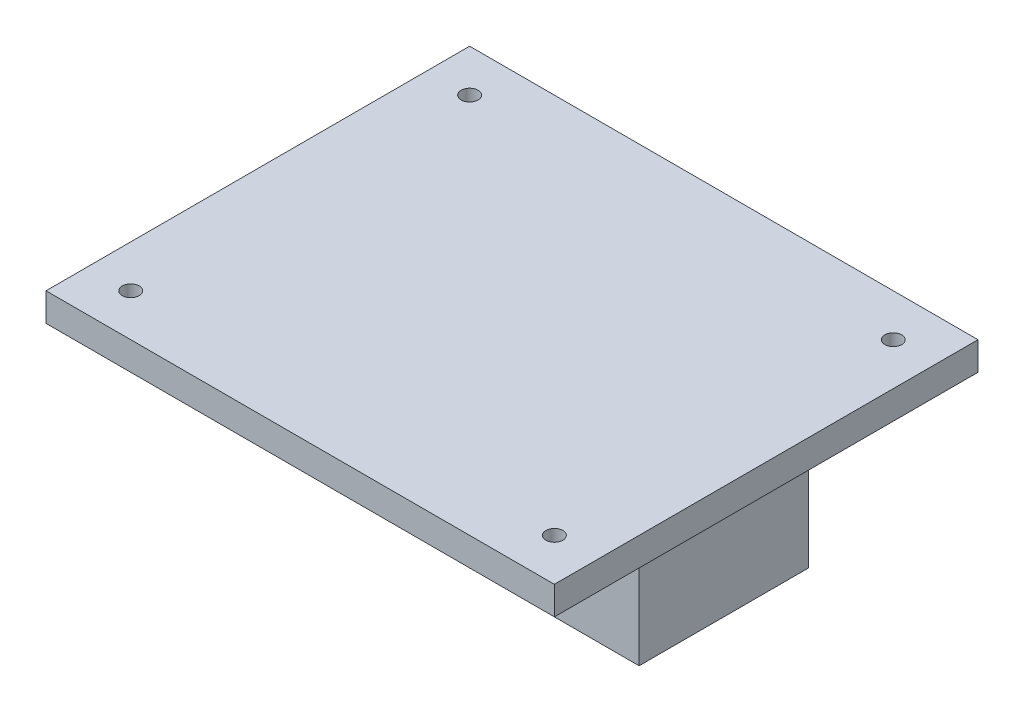
ISO-10303-21;
HEADER;
FILE_DESCRIPTION(('STEP AP214'),'2;1');
FILE_NAME('part.step','',(''),(''),'','','');
FILE_SCHEMA(('AUTOMOTIVE_DESIGN { 1 0 10303 214 1 1 1 1 }'));
ENDSEC;
DATA;
#1=APPLICATION_CONTEXT('core data for automotive mechanical design processes');
#2=APPLICATION_PROTOCOL_DEFINITION('international standard','automotive_design',2000,#1);
#3=PRODUCT_CONTEXT('',#1,'mechanical');
#4=PRODUCT('Part','Part','',(#3));
#5=PRODUCT_RELATED_PRODUCT_CATEGORY('part','',(#4));
#6=PRODUCT_DEFINITION_FORMATION('','',#4);
#7=PRODUCT_DEFINITION_CONTEXT('part definition',#1,'design');
#8=PRODUCT_DEFINITION('design','',#6,#7);
#9=PRODUCT_DEFINITION_SHAPE('','',#8);
#10=(LENGTH_UNIT() NAMED_UNIT(*) SI_UNIT(.MILLI.,.METRE.));
#11=(NAMED_UNIT(*) PLANE_ANGLE_UNIT() SI_UNIT($,.RADIAN.));
#12=(NAMED_UNIT(*) SI_UNIT($,.STERADIAN.) SOLID_ANGLE_UNIT());
#13=UNCERTAINTY_MEASURE_WITH_UNIT(LENGTH_MEASURE(1.E-05),#10,'distance_accuracy_value','');
#14=(GEOMETRIC_REPRESENTATION_CONTEXT(3) GLOBAL_UNCERTAINTY_ASSIGNED_CONTEXT((#13)) GLOBAL_UNIT_ASSIGNED_CONTEXT((#10,
#11,#12)) REPRESENTATION_CONTEXT('',''));
#15=CARTESIAN_POINT('',(0.,0.,0.));
#16=DIRECTION('',(0.,0.,1.));
#17=DIRECTION('',(1.,0.,0.));
#18=AXIS2_PLACEMENT_3D('',#15,#16,#17);
#19=CARTESIAN_POINT('',(0.,0.,0.));
#20=DIRECTION('',(0.,1.,0.));
#21=DIRECTION('',(0.,0.,1.));
#22=AXIS2_PLACEMENT_3D('',#19,#20,#21);
#23=PLANE('',#22);
#24=DIRECTION('',(0.,0.,1.));
#25=VECTOR('',#24,1.);
#26=CARTESIAN_POINT('',(-45.,0.,30.));
#27=LINE('',#26,#25);
#28=CARTESIAN_POINT('',(-45.,0.,-30.));
#29=VERTEX_POINT('',#28);
#30=CARTESIAN_POINT('',(-45.,0.,30.));
#31=VERTEX_POINT('',#30);
#32=EDGE_CURVE('E262',#29,#31,#27,.T.);
#33=ORIENTED_EDGE('',*,*,#32,.F.);
#34=DIRECTION('',(1.,0.,0.));
#35=VECTOR('',#34,1.);
#36=CARTESIAN_POINT('',(-75.,0.,-30.));
#37=LINE('',#36,#35);
#38=CARTESIAN_POINT('',(-75.,0.,-30.));
#39=VERTEX_POINT('',#38);
#40=EDGE_CURVE('E267',#39,#29,#37,.T.);
#41=ORIENTED_EDGE('',*,*,#40,.F.);
#42=DIRECTION('',(0.,0.,-1.));
#43=VECTOR('',#42,1.);
#44=CARTESIAN_POINT('',(-75.,0.,30.));
#45=LINE('',#44,#43);
#46=CARTESIAN_POINT('',(-75.,0.,30.));
#47=VERTEX_POINT('',#46);
#48=EDGE_CURVE('E281',#47,#39,#45,.T.);
#49=ORIENTED_EDGE('',*,*,#48,.F.);
#50=DIRECTION('',(-1.,0.,0.));
#51=VECTOR('',#50,1.);
#52=CARTESIAN_POINT('',(-75.,0.,30.));
#53=LINE('',#52,#51);
#54=EDGE_CURVE('E278',#31,#47,#53,.T.);
#55=ORIENTED_EDGE('',*,*,#54,.F.);
#56=EDGE_LOOP('',(#33,#41,#49,#55));
#57=FACE_BOUND('',#56,.T.);
#58=CARTESIAN_POINT('',(75.,0.,-60.));
#59=DIRECTION('',(0.,1.,0.));
#60=DIRECTION('',(0.,0.,1.));
#61=AXIS2_PLACEMENT_3D('',#58,#59,#60);
#62=CIRCLE('',#61,3.00000000000001);
#63=CARTESIAN_POINT('',(75.,0.,-57.));
#64=VERTEX_POINT('',#63);
#65=EDGE_CURVE('E39',#64,#64,#62,.T.);
#66=ORIENTED_EDGE('',*,*,#65,.T.);
#67=EDGE_LOOP('',(#66));
#68=FACE_BOUND('',#67,.T.);
#69=CARTESIAN_POINT('',(75.,0.,60.));
#70=DIRECTION('',(0.,1.,0.));
#71=DIRECTION('',(0.,0.,1.));
#72=AXIS2_PLACEMENT_3D('',#69,#70,#71);
#73=CIRCLE('',#72,3.00000000000001);
#74=CARTESIAN_POINT('',(75.,0.,63.));
#75=VERTEX_POINT('',#74);
#76=EDGE_CURVE('E340',#75,#75,#73,.T.);
#77=ORIENTED_EDGE('',*,*,#76,.T.);
#78=EDGE_LOOP('',(#77));
#79=FACE_BOUND('',#78,.T.);
#80=CARTESIAN_POINT('',(-75.,0.,60.));
#81=DIRECTION('',(0.,1.,0.));
#82=DIRECTION('',(0.,0.,1.));
#83=AXIS2_PLACEMENT_3D('',#80,#81,#82);
#84=CIRCLE('',#83,3.00000000000001);
#85=CARTESIAN_POINT('',(-75.,0.,63.));
#86=VERTEX_POINT('',#85);
#87=EDGE_CURVE('E338',#86,#86,#84,.T.);
#88=ORIENTED_EDGE('',*,*,#87,.T.);
#89=EDGE_LOOP('',(#88));
#90=FACE_BOUND('',#89,.T.);
#91=CARTESIAN_POINT('',(-75.,0.,-60.));
#92=DIRECTION('',(0.,1.,0.));
#93=DIRECTION('',(0.,0.,1.));
#94=AXIS2_PLACEMENT_3D('',#91,#92,#93);
#95=CIRCLE('',#94,3.00000000000001);
#96=CARTESIAN_POINT('',(-75.,0.,-57.));
#97=VERTEX_POINT('',#96);
#98=EDGE_CURVE('E309',#97,#97,#95,.T.);
#99=ORIENTED_EDGE('',*,*,#98,.T.);
#100=EDGE_LOOP('',(#99));
#101=FACE_BOUND('',#100,.T.);
#102=DIRECTION('',(0.,0.,-1.));
#103=VECTOR('',#102,1.);
#104=CARTESIAN_POINT('',(90.,0.,-75.));
#105=LINE('',#104,#103);
#106=CARTESIAN_POINT('',(90.,0.,75.));
#107=VERTEX_POINT('',#106);
#108=CARTESIAN_POINT('',(90.,0.,-75.));
#109=VERTEX_POINT('',#108);
#110=EDGE_CURVE('E321',#107,#109,#105,.T.);
#111=ORIENTED_EDGE('',*,*,#110,.F.);
#112=DIRECTION('',(1.,0.,0.));
#113=VECTOR('',#112,1.);
#114=CARTESIAN_POINT('',(-90.,0.,75.));
#115=LINE('',#114,#113);
#116=CARTESIAN_POINT('',(-90.,0.,75.));
#117=VERTEX_POINT('',#116);
#118=EDGE_CURVE('E314',#117,#107,#115,.T.);
#119=ORIENTED_EDGE('',*,*,#118,.F.);
#120=DIRECTION('',(0.,0.,1.));
#121=VECTOR('',#120,1.);
#122=CARTESIAN_POINT('',(-90.,0.,-75.));
#123=LINE('',#122,#121);
#124=CARTESIAN_POINT('',(-90.,0.,-75.));
#125=VERTEX_POINT('',#124);
#126=EDGE_CURVE('E326',#125,#117,#123,.T.);
#127=ORIENTED_EDGE('',*,*,#126,.F.);
#128=DIRECTION('',(-1.,0.,0.));
#129=VECTOR('',#128,1.);
#130=CARTESIAN_POINT('',(-90.,0.,-75.));
#131=LINE('',#130,#129);
#132=EDGE_CURVE('E324',#109,#125,#131,.T.);
#133=ORIENTED_EDGE('',*,*,#132,.F.);
#134=EDGE_LOOP('',(#111,#119,#127,#133));
#135=FACE_BOUND('',#134,.T.);
#136=DIRECTION('',(0.,0.,1.));
#137=VECTOR('',#136,1.);
#138=CARTESIAN_POINT('',(75.,0.,30.));
#139=LINE('',#138,#137);
#140=CARTESIAN_POINT('',(75.,0.,-30.));
#141=VERTEX_POINT('',#140);
#142=CARTESIAN_POINT('',(75.,0.,30.));
#143=VERTEX_POINT('',#142);
#144=EDGE_CURVE('E223',#141,#143,#139,.T.);
#145=ORIENTED_EDGE('',*,*,#144,.F.);
#146=DIRECTION('',(1.,0.,0.));
#147=VECTOR('',#146,1.);
#148=CARTESIAN_POINT('',(75.,0.,-30.));
#149=LINE('',#148,#147);
#150=CARTESIAN_POINT('',(45.,0.,-30.));
#151=VERTEX_POINT('',#150);
#152=EDGE_CURVE('E234',#151,#141,#149,.T.);
#153=ORIENTED_EDGE('',*,*,#152,.F.);
#154=DIRECTION('',(0.,0.,-1.));
#155=VECTOR('',#154,1.);
#156=CARTESIAN_POINT('',(45.,0.,30.));
#157=LINE('',#156,#155);
#158=CARTESIAN_POINT('',(45.,0.,30.));
#159=VERTEX_POINT('',#158);
#160=EDGE_CURVE('E246',#159,#151,#157,.T.);
#161=ORIENTED_EDGE('',*,*,#160,.F.);
#162=DIRECTION('',(-1.,0.,0.));
#163=VECTOR('',#162,1.);
#164=CARTESIAN_POINT('',(75.,0.,30.));
#165=LINE('',#164,#163);
#166=EDGE_CURVE('E243',#143,#159,#165,.T.);
#167=ORIENTED_EDGE('',*,*,#166,.F.);
#168=EDGE_LOOP('',(#145,#153,#161,#167));
#169=FACE_BOUND('',#168,.T.);
#170=ADVANCED_FACE('F35',(#57,#68,#79,#90,#101,#135,#169),#23,.F.);
#171=CARTESIAN_POINT('',(90.,10.,-75.));
#172=DIRECTION('',(-1.,0.,0.));
#173=DIRECTION('',(0.,0.,1.));
#174=AXIS2_PLACEMENT_3D('',#171,#172,#173);
#175=PLANE('',#174);
#176=ORIENTED_EDGE('',*,*,#110,.T.);
#177=DIRECTION('',(0.,-1.,0.));
#178=VECTOR('',#177,1.);
#179=CARTESIAN_POINT('',(90.,10.,-75.));
#180=LINE('',#179,#178);
#181=CARTESIAN_POINT('',(90.,10.,-75.));
#182=VERTEX_POINT('',#181);
#183=EDGE_CURVE('E11',#182,#109,#180,.T.);
#184=ORIENTED_EDGE('',*,*,#183,.F.);
#185=DIRECTION('',(0.,0.,-1.));
#186=VECTOR('',#185,1.);
#187=CARTESIAN_POINT('',(90.,10.,-75.));
#188=LINE('',#187,#186);
#189=CARTESIAN_POINT('',(90.,10.,75.));
#190=VERTEX_POINT('',#189);
#191=EDGE_CURVE('E310',#190,#182,#188,.T.);
#192=ORIENTED_EDGE('',*,*,#191,.F.);
#193=DIRECTION('',(0.,-1.,0.));
#194=VECTOR('',#193,1.);
#195=CARTESIAN_POINT('',(90.,10.,75.));
#196=LINE('',#195,#194);
#197=EDGE_CURVE('E320',#190,#107,#196,.T.);
#198=ORIENTED_EDGE('',*,*,#197,.T.);
#199=EDGE_LOOP('',(#176,#184,#192,#198));
#200=FACE_BOUND('',#199,.T.);
#201=ADVANCED_FACE('F37',(#200),#175,.F.);
#202=CARTESIAN_POINT('',(-90.,10.,-75.));
#203=DIRECTION('',(0.,0.,1.));
#204=DIRECTION('',(1.,0.,0.));
#205=AXIS2_PLACEMENT_3D('',#202,#203,#204);
#206=PLANE('',#205);
#207=ORIENTED_EDGE('',*,*,#132,.T.);
#208=DIRECTION('',(0.,-1.,0.));
#209=VECTOR('',#208,1.);
#210=CARTESIAN_POINT('',(-90.,10.,-75.));
#211=LINE('',#210,#209);
#212=CARTESIAN_POINT('',(-90.,10.,-75.));
#213=VERTEX_POINT('',#212);
#214=EDGE_CURVE('E44',#213,#125,#211,.T.);
#215=ORIENTED_EDGE('',*,*,#214,.F.);
#216=DIRECTION('',(-1.,0.,0.));
#217=VECTOR('',#216,1.);
#218=CARTESIAN_POINT('',(-90.,10.,-75.));
#219=LINE('',#218,#217);
#220=EDGE_CURVE('E313',#182,#213,#219,.T.);
#221=ORIENTED_EDGE('',*,*,#220,.F.);
#222=ORIENTED_EDGE('',*,*,#183,.T.);
#223=EDGE_LOOP('',(#207,#215,#221,#222));
#224=FACE_BOUND('',#223,.T.);
#225=ADVANCED_FACE('F371',(#224),#206,.F.);
#226=CARTESIAN_POINT('',(-90.,10.,-75.));
#227=DIRECTION('',(1.,0.,0.));
#228=DIRECTION('',(0.,0.,-1.));
#229=AXIS2_PLACEMENT_3D('',#226,#227,#228);
#230=PLANE('',#229);
#231=ORIENTED_EDGE('',*,*,#126,.T.);
#232=DIRECTION('',(0.,-1.,0.));
#233=VECTOR('',#232,1.);
#234=CARTESIAN_POINT('',(-90.,10.,75.));
#235=LINE('',#234,#233);
#236=CARTESIAN_POINT('',(-90.,10.,75.));
#237=VERTEX_POINT('',#236);
#238=EDGE_CURVE('E331',#237,#117,#235,.T.);
#239=ORIENTED_EDGE('',*,*,#238,.F.);
#240=DIRECTION('',(0.,0.,1.));
#241=VECTOR('',#240,1.);
#242=CARTESIAN_POINT('',(-90.,10.,-75.));
#243=LINE('',#242,#241);
#244=EDGE_CURVE('E316',#213,#237,#243,.T.);
#245=ORIENTED_EDGE('',*,*,#244,.F.);
#246=ORIENTED_EDGE('',*,*,#214,.T.);
#247=EDGE_LOOP('',(#231,#239,#245,#246));
#248=FACE_BOUND('',#247,.T.);
#249=ADVANCED_FACE('F379',(#248),#230,.F.);
#250=CARTESIAN_POINT('',(-90.,10.,75.));
#251=DIRECTION('',(0.,0.,-1.));
#252=DIRECTION('',(-1.,0.,0.));
#253=AXIS2_PLACEMENT_3D('',#250,#251,#252);
#254=PLANE('',#253);
#255=ORIENTED_EDGE('',*,*,#118,.T.);
#256=ORIENTED_EDGE('',*,*,#197,.F.);
#257=DIRECTION('',(1.,0.,0.));
#258=VECTOR('',#257,1.);
#259=CARTESIAN_POINT('',(-90.,10.,75.));
#260=LINE('',#259,#258);
#261=EDGE_CURVE('E318',#237,#190,#260,.T.);
#262=ORIENTED_EDGE('',*,*,#261,.F.);
#263=ORIENTED_EDGE('',*,*,#238,.T.);
#264=EDGE_LOOP('',(#255,#256,#262,#263));
#265=FACE_BOUND('',#264,.T.);
#266=ADVANCED_FACE('F376',(#265),#254,.F.);
#267=CARTESIAN_POINT('',(0.,10.,0.));
#268=DIRECTION('',(0.,1.,0.));
#269=DIRECTION('',(0.,0.,1.));
#270=AXIS2_PLACEMENT_3D('',#267,#268,#269);
#271=PLANE('',#270);
#272=CARTESIAN_POINT('',(75.,10.,-60.));
#273=DIRECTION('',(0.,1.,0.));
#274=DIRECTION('',(0.,0.,1.));
#275=AXIS2_PLACEMENT_3D('',#272,#273,#274);
#276=CIRCLE('',#275,3.00000000000001);
#277=CARTESIAN_POINT('',(75.,10.,-57.));
#278=VERTEX_POINT('',#277);
#279=EDGE_CURVE('E297',#278,#278,#276,.T.);
#280=ORIENTED_EDGE('',*,*,#279,.F.);
#281=EDGE_LOOP('',(#280));
#282=FACE_BOUND('',#281,.T.);
#283=CARTESIAN_POINT('',(75.,10.,60.));
#284=DIRECTION('',(0.,1.,0.));
#285=DIRECTION('',(0.,0.,1.));
#286=AXIS2_PLACEMENT_3D('',#283,#284,#285);
#287=CIRCLE('',#286,3.00000000000001);
#288=CARTESIAN_POINT('',(75.,10.,63.));
#289=VERTEX_POINT('',#288);
#290=EDGE_CURVE('E302',#289,#289,#287,.T.);
#291=ORIENTED_EDGE('',*,*,#290,.F.);
#292=EDGE_LOOP('',(#291));
#293=FACE_BOUND('',#292,.T.);
#294=CARTESIAN_POINT('',(-75.,10.,60.));
#295=DIRECTION('',(0.,1.,0.));
#296=DIRECTION('',(0.,0.,1.));
#297=AXIS2_PLACEMENT_3D('',#294,#295,#296);
#298=CIRCLE('',#297,3.00000000000001);
#299=CARTESIAN_POINT('',(-75.,10.,63.));
#300=VERTEX_POINT('',#299);
#301=EDGE_CURVE('E298',#300,#300,#298,.T.);
#302=ORIENTED_EDGE('',*,*,#301,.F.);
#303=EDGE_LOOP('',(#302));
#304=FACE_BOUND('',#303,.T.);
#305=CARTESIAN_POINT('',(-75.,10.,-60.));
#306=DIRECTION('',(0.,1.,0.));
#307=DIRECTION('',(0.,0.,1.));
#308=AXIS2_PLACEMENT_3D('',#305,#306,#307);
#309=CIRCLE('',#308,3.00000000000001);
#310=CARTESIAN_POINT('',(-75.,10.,-57.));
#311=VERTEX_POINT('',#310);
#312=EDGE_CURVE('E301',#311,#311,#309,.T.);
#313=ORIENTED_EDGE('',*,*,#312,.F.);
#314=EDGE_LOOP('',(#313));
#315=FACE_BOUND('',#314,.T.);
#316=ORIENTED_EDGE('',*,*,#191,.T.);
#317=ORIENTED_EDGE('',*,*,#220,.T.);
#318=ORIENTED_EDGE('',*,*,#244,.T.);
#319=ORIENTED_EDGE('',*,*,#261,.T.);
#320=EDGE_LOOP('',(#316,#317,#318,#319));
#321=FACE_BOUND('',#320,.T.);
#322=ADVANCED_FACE('F375',(#282,#293,#304,#315,#321),#271,.T.);
#323=CARTESIAN_POINT('',(-75.,-25.,-60.));
#324=DIRECTION('',(0.,1.,0.));
#325=DIRECTION('',(0.,0.,1.));
#326=AXIS2_PLACEMENT_3D('',#323,#324,#325);
#327=CYLINDRICAL_SURFACE('',#326,3.00000000000001);
#328=ORIENTED_EDGE('',*,*,#312,.T.);
#329=EDGE_LOOP('',(#328));
#330=FACE_BOUND('',#329,.T.);
#331=ORIENTED_EDGE('',*,*,#98,.F.);
#332=EDGE_LOOP('',(#331));
#333=FACE_BOUND('',#332,.T.);
#334=ADVANCED_FACE('F401',(#330,#333),#327,.F.);
#335=CARTESIAN_POINT('',(-75.,-25.,60.));
#336=DIRECTION('',(0.,1.,0.));
#337=DIRECTION('',(0.,0.,1.));
#338=AXIS2_PLACEMENT_3D('',#335,#336,#337);
#339=CYLINDRICAL_SURFACE('',#338,3.00000000000001);
#340=ORIENTED_EDGE('',*,*,#301,.T.);
#341=EDGE_LOOP('',(#340));
#342=FACE_BOUND('',#341,.T.);
#343=ORIENTED_EDGE('',*,*,#87,.F.);
#344=EDGE_LOOP('',(#343));
#345=FACE_BOUND('',#344,.T.);
#346=ADVANCED_FACE('F361',(#342,#345),#339,.F.);
#347=CARTESIAN_POINT('',(75.,-25.,60.));
#348=DIRECTION('',(0.,1.,0.));
#349=DIRECTION('',(0.,0.,1.));
#350=AXIS2_PLACEMENT_3D('',#347,#348,#349);
#351=CYLINDRICAL_SURFACE('',#350,3.00000000000001);
#352=ORIENTED_EDGE('',*,*,#290,.T.);
#353=EDGE_LOOP('',(#352));
#354=FACE_BOUND('',#353,.T.);
#355=ORIENTED_EDGE('',*,*,#76,.F.);
#356=EDGE_LOOP('',(#355));
#357=FACE_BOUND('',#356,.T.);
#358=ADVANCED_FACE('F351',(#354,#357),#351,.F.);
#359=CARTESIAN_POINT('',(75.,-25.,-60.));
#360=DIRECTION('',(0.,1.,0.));
#361=DIRECTION('',(0.,0.,1.));
#362=AXIS2_PLACEMENT_3D('',#359,#360,#361);
#363=CYLINDRICAL_SURFACE('',#362,3.00000000000001);
#364=ORIENTED_EDGE('',*,*,#279,.T.);
#365=EDGE_LOOP('',(#364));
#366=FACE_BOUND('',#365,.T.);
#367=ORIENTED_EDGE('',*,*,#65,.F.);
#368=EDGE_LOOP('',(#367));
#369=FACE_BOUND('',#368,.T.);
#370=ADVANCED_FACE('F348',(#366,#369),#363,.F.);
#371=CARTESIAN_POINT('',(-45.,-45.,30.));
#372=DIRECTION('',(-1.,0.,0.));
#373=DIRECTION('',(0.,0.,1.));
#374=AXIS2_PLACEMENT_3D('',#371,#372,#373);
#375=PLANE('',#374);
#376=ORIENTED_EDGE('',*,*,#32,.T.);
#377=DIRECTION('',(0.,1.,0.));
#378=VECTOR('',#377,1.);
#379=CARTESIAN_POINT('',(-45.,-45.,30.));
#380=LINE('',#379,#378);
#381=CARTESIAN_POINT('',(-45.,-45.,30.));
#382=VERTEX_POINT('',#381);
#383=EDGE_CURVE('E294',#382,#31,#380,.T.);
#384=ORIENTED_EDGE('',*,*,#383,.F.);
#385=DIRECTION('',(0.,0.,1.));
#386=VECTOR('',#385,1.);
#387=CARTESIAN_POINT('',(-45.,-45.,30.));
#388=LINE('',#387,#386);
#389=CARTESIAN_POINT('',(-45.,-45.,-30.));
#390=VERTEX_POINT('',#389);
#391=EDGE_CURVE('E263',#390,#382,#388,.T.);
#392=ORIENTED_EDGE('',*,*,#391,.F.);
#393=DIRECTION('',(0.,1.,0.));
#394=VECTOR('',#393,1.);
#395=CARTESIAN_POINT('',(-45.,-45.,-30.));
#396=LINE('',#395,#394);
#397=EDGE_CURVE('E275',#390,#29,#396,.T.);
#398=ORIENTED_EDGE('',*,*,#397,.T.);
#399=EDGE_LOOP('',(#376,#384,#392,#398));
#400=FACE_BOUND('',#399,.T.);
#401=ADVANCED_FACE('F350',(#400),#375,.F.);
#402=CARTESIAN_POINT('',(-75.,-45.,30.));
#403=DIRECTION('',(0.,0.,-1.));
#404=DIRECTION('',(-1.,0.,0.));
#405=AXIS2_PLACEMENT_3D('',#402,#403,#404);
#406=PLANE('',#405);
#407=ORIENTED_EDGE('',*,*,#54,.T.);
#408=DIRECTION('',(0.,1.,0.));
#409=VECTOR('',#408,1.);
#410=CARTESIAN_POINT('',(-75.,-45.,30.));
#411=LINE('',#410,#409);
#412=CARTESIAN_POINT('',(-75.,-45.,30.));
#413=VERTEX_POINT('',#412);
#414=EDGE_CURVE('E291',#413,#47,#411,.T.);
#415=ORIENTED_EDGE('',*,*,#414,.F.);
#416=DIRECTION('',(-1.,0.,0.));
#417=VECTOR('',#416,1.);
#418=CARTESIAN_POINT('',(-75.,-45.,30.));
#419=LINE('',#418,#417);
#420=EDGE_CURVE('E266',#382,#413,#419,.T.);
#421=ORIENTED_EDGE('',*,*,#420,.F.);
#422=ORIENTED_EDGE('',*,*,#383,.T.);
#423=EDGE_LOOP('',(#407,#415,#421,#422));
#424=FACE_BOUND('',#423,.T.);
#425=ADVANCED_FACE('F358',(#424),#406,.F.);
#426=CARTESIAN_POINT('',(-75.,-45.,30.));
#427=DIRECTION('',(1.,0.,0.));
#428=DIRECTION('',(0.,0.,-1.));
#429=AXIS2_PLACEMENT_3D('',#426,#427,#428);
#430=PLANE('',#429);
#431=ORIENTED_EDGE('',*,*,#48,.T.);
#432=DIRECTION('',(0.,1.,0.));
#433=VECTOR('',#432,1.);
#434=CARTESIAN_POINT('',(-75.,-45.,-30.));
#435=LINE('',#434,#433);
#436=CARTESIAN_POINT('',(-75.,-45.,-30.));
#437=VERTEX_POINT('',#436);
#438=EDGE_CURVE('E288',#437,#39,#435,.T.);
#439=ORIENTED_EDGE('',*,*,#438,.F.);
#440=DIRECTION('',(0.,0.,-1.));
#441=VECTOR('',#440,1.);
#442=CARTESIAN_POINT('',(-75.,-45.,30.));
#443=LINE('',#442,#441);
#444=EDGE_CURVE('E269',#413,#437,#443,.T.);
#445=ORIENTED_EDGE('',*,*,#444,.F.);
#446=ORIENTED_EDGE('',*,*,#414,.T.);
#447=EDGE_LOOP('',(#431,#439,#445,#446));
#448=FACE_BOUND('',#447,.T.);
#449=ADVANCED_FACE('F428',(#448),#430,.F.);
#450=CARTESIAN_POINT('',(-75.,-45.,-30.));
#451=DIRECTION('',(0.,0.,1.));
#452=DIRECTION('',(1.,0.,0.));
#453=AXIS2_PLACEMENT_3D('',#450,#451,#452);
#454=PLANE('',#453);
#455=DIRECTION('',(1.,0.,0.));
#456=VECTOR('',#455,1.);
#457=CARTESIAN_POINT('',(-75.,-45.,-30.));
#458=LINE('',#457,#456);
#459=CARTESIAN_POINT('',(-52.5,-45.,-30.));
#460=VERTEX_POINT('',#459);
#461=EDGE_CURVE('E271',#460,#390,#458,.T.);
#462=ORIENTED_EDGE('',*,*,#461,.F.);
#463=DIRECTION('',(0.,-1.,0.));
#464=VECTOR('',#463,1.);
#465=CARTESIAN_POINT('',(-52.5,-42.,-30.));
#466=LINE('',#465,#464);
#467=CARTESIAN_POINT('',(-52.5,-42.,-30.));
#468=VERTEX_POINT('',#467);
#469=EDGE_CURVE('E214',#468,#460,#466,.T.);
#470=ORIENTED_EDGE('',*,*,#469,.F.);
#471=DIRECTION('',(1.,0.,0.));
#472=VECTOR('',#471,1.);
#473=CARTESIAN_POINT('',(-52.5,-42.,-30.));
#474=LINE('',#473,#472);
#475=CARTESIAN_POINT('',(-67.5,-42.,-30.));
#476=VERTEX_POINT('',#475);
#477=EDGE_CURVE('E206',#476,#468,#474,.T.);
#478=ORIENTED_EDGE('',*,*,#477,.F.);
#479=DIRECTION('',(0.,1.,0.));
#480=VECTOR('',#479,1.);
#481=CARTESIAN_POINT('',(-67.5,-42.,-30.));
#482=LINE('',#481,#480);
#483=CARTESIAN_POINT('',(-67.5,-45.,-30.));
#484=VERTEX_POINT('',#483);
#485=EDGE_CURVE('E216',#484,#476,#482,.T.);
#486=ORIENTED_EDGE('',*,*,#485,.F.);
#487=EDGE_CURVE('E272',#437,#484,#458,.T.);
#488=ORIENTED_EDGE('',*,*,#487,.F.);
#489=ORIENTED_EDGE('',*,*,#438,.T.);
#490=ORIENTED_EDGE('',*,*,#40,.T.);
#491=ORIENTED_EDGE('',*,*,#397,.F.);
#492=EDGE_LOOP('',(#462,#470,#478,#486,#488,#489,#490,#491));
#493=FACE_BOUND('',#492,.T.);
#494=ADVANCED_FACE('F432',(#493),#454,.F.);
#495=CARTESIAN_POINT('',(0.,-45.,0.));
#496=DIRECTION('',(0.,-1.,0.));
#497=DIRECTION('',(0.,0.,-1.));
#498=AXIS2_PLACEMENT_3D('',#495,#496,#497);
#499=PLANE('',#498);
#500=DIRECTION('',(0.,0.,-1.));
#501=VECTOR('',#500,1.);
#502=CARTESIAN_POINT('',(-52.5,-45.,20.));
#503=LINE('',#502,#501);
#504=CARTESIAN_POINT('',(-52.5,-45.,20.));
#505=VERTEX_POINT('',#504);
#506=EDGE_CURVE('E213',#505,#460,#503,.T.);
#507=ORIENTED_EDGE('',*,*,#506,.T.);
#508=ORIENTED_EDGE('',*,*,#461,.T.);
#509=ORIENTED_EDGE('',*,*,#391,.T.);
#510=ORIENTED_EDGE('',*,*,#420,.T.);
#511=ORIENTED_EDGE('',*,*,#444,.T.);
#512=ORIENTED_EDGE('',*,*,#487,.T.);
#513=DIRECTION('',(0.,0.,-1.));
#514=VECTOR('',#513,1.);
#515=CARTESIAN_POINT('',(-67.5,-45.,20.));
#516=LINE('',#515,#514);
#517=CARTESIAN_POINT('',(-67.5,-45.,20.));
#518=VERTEX_POINT('',#517);
#519=EDGE_CURVE('E226',#518,#484,#516,.T.);
#520=ORIENTED_EDGE('',*,*,#519,.F.);
#521=DIRECTION('',(-1.,0.,0.));
#522=VECTOR('',#521,1.);
#523=CARTESIAN_POINT('',(-52.5,-45.,20.));
#524=LINE('',#523,#522);
#525=EDGE_CURVE('E205',#505,#518,#524,.T.);
#526=ORIENTED_EDGE('',*,*,#525,.F.);
#527=EDGE_LOOP('',(#507,#508,#509,#510,#511,#512,#520,#526));
#528=FACE_BOUND('',#527,.T.);
#529=ADVANCED_FACE('F436',(#528),#499,.T.);
#530=CARTESIAN_POINT('',(75.,-45.,30.));
#531=DIRECTION('',(-1.,0.,0.));
#532=DIRECTION('',(0.,0.,1.));
#533=AXIS2_PLACEMENT_3D('',#530,#531,#532);
#534=PLANE('',#533);
#535=ORIENTED_EDGE('',*,*,#144,.T.);
#536=DIRECTION('',(0.,1.,0.));
#537=VECTOR('',#536,1.);
#538=CARTESIAN_POINT('',(75.,-45.,30.));
#539=LINE('',#538,#537);
#540=CARTESIAN_POINT('',(75.,-45.,30.));
#541=VERTEX_POINT('',#540);
#542=EDGE_CURVE('E259',#541,#143,#539,.T.);
#543=ORIENTED_EDGE('',*,*,#542,.F.);
#544=DIRECTION('',(0.,0.,1.));
#545=VECTOR('',#544,1.);
#546=CARTESIAN_POINT('',(75.,-45.,30.));
#547=LINE('',#546,#545);
#548=CARTESIAN_POINT('',(75.,-45.,-30.));
#549=VERTEX_POINT('',#548);
#550=EDGE_CURVE('E230',#549,#541,#547,.T.);
#551=ORIENTED_EDGE('',*,*,#550,.F.);
#552=DIRECTION('',(0.,1.,0.));
#553=VECTOR('',#552,1.);
#554=CARTESIAN_POINT('',(75.,-45.,-30.));
#555=LINE('',#554,#553);
#556=EDGE_CURVE('E240',#549,#141,#555,.T.);
#557=ORIENTED_EDGE('',*,*,#556,.T.);
#558=EDGE_LOOP('',(#535,#543,#551,#557));
#559=FACE_BOUND('',#558,.T.);
#560=ADVANCED_FACE('F440',(#559),#534,.F.);
#561=CARTESIAN_POINT('',(75.,-45.,30.));
#562=DIRECTION('',(0.,0.,-1.));
#563=DIRECTION('',(-1.,0.,0.));
#564=AXIS2_PLACEMENT_3D('',#561,#562,#563);
#565=PLANE('',#564);
#566=ORIENTED_EDGE('',*,*,#166,.T.);
#567=DIRECTION('',(0.,1.,0.));
#568=VECTOR('',#567,1.);
#569=CARTESIAN_POINT('',(45.,-45.,30.));
#570=LINE('',#569,#568);
#571=CARTESIAN_POINT('',(45.,-45.,30.));
#572=VERTEX_POINT('',#571);
#573=EDGE_CURVE('E256',#572,#159,#570,.T.);
#574=ORIENTED_EDGE('',*,*,#573,.F.);
#575=DIRECTION('',(-1.,0.,0.));
#576=VECTOR('',#575,1.);
#577=CARTESIAN_POINT('',(75.,-45.,30.));
#578=LINE('',#577,#576);
#579=EDGE_CURVE('E233',#541,#572,#578,.T.);
#580=ORIENTED_EDGE('',*,*,#579,.F.);
#581=ORIENTED_EDGE('',*,*,#542,.T.);
#582=EDGE_LOOP('',(#566,#574,#580,#581));
#583=FACE_BOUND('',#582,.T.);
#584=ADVANCED_FACE('F444',(#583),#565,.F.);
#585=CARTESIAN_POINT('',(45.,-45.,30.));
#586=DIRECTION('',(1.,0.,0.));
#587=DIRECTION('',(0.,0.,-1.));
#588=AXIS2_PLACEMENT_3D('',#585,#586,#587);
#589=PLANE('',#588);
#590=ORIENTED_EDGE('',*,*,#160,.T.);
#591=DIRECTION('',(0.,1.,0.));
#592=VECTOR('',#591,1.);
#593=CARTESIAN_POINT('',(45.,-45.,-30.));
#594=LINE('',#593,#592);
#595=CARTESIAN_POINT('',(45.,-45.,-30.));
#596=VERTEX_POINT('',#595);
#597=EDGE_CURVE('E253',#596,#151,#594,.T.);
#598=ORIENTED_EDGE('',*,*,#597,.F.);
#599=DIRECTION('',(0.,0.,-1.));
#600=VECTOR('',#599,1.);
#601=CARTESIAN_POINT('',(45.,-45.,30.));
#602=LINE('',#601,#600);
#603=EDGE_CURVE('E236',#572,#596,#602,.T.);
#604=ORIENTED_EDGE('',*,*,#603,.F.);
#605=ORIENTED_EDGE('',*,*,#573,.T.);
#606=EDGE_LOOP('',(#590,#598,#604,#605));
#607=FACE_BOUND('',#606,.T.);
#608=ADVANCED_FACE('F448',(#607),#589,.F.);
#609=CARTESIAN_POINT('',(75.,-45.,-30.));
#610=DIRECTION('',(0.,0.,1.));
#611=DIRECTION('',(1.,0.,0.));
#612=AXIS2_PLACEMENT_3D('',#609,#610,#611);
#613=PLANE('',#612);
#614=DIRECTION('',(1.,0.,0.));
#615=VECTOR('',#614,1.);
#616=CARTESIAN_POINT('',(75.,-45.,-30.));
#617=LINE('',#616,#615);
#618=CARTESIAN_POINT('',(67.5,-45.,-30.));
#619=VERTEX_POINT('',#618);
#620=EDGE_CURVE('E238',#619,#549,#617,.T.);
#621=ORIENTED_EDGE('',*,*,#620,.F.);
#622=DIRECTION('',(0.,-1.,0.));
#623=VECTOR('',#622,1.);
#624=CARTESIAN_POINT('',(67.5,-42.,-30.));
#625=LINE('',#624,#623);
#626=CARTESIAN_POINT('',(67.5,-42.,-30.));
#627=VERTEX_POINT('',#626);
#628=EDGE_CURVE('E650',#627,#619,#625,.T.);
#629=ORIENTED_EDGE('',*,*,#628,.F.);
#630=DIRECTION('',(1.,0.,0.));
#631=VECTOR('',#630,1.);
#632=CARTESIAN_POINT('',(67.5,-42.,-30.));
#633=LINE('',#632,#631);
#634=CARTESIAN_POINT('',(52.5,-42.,-30.));
#635=VERTEX_POINT('',#634);
#636=EDGE_CURVE('E645',#635,#627,#633,.T.);
#637=ORIENTED_EDGE('',*,*,#636,.F.);
#638=DIRECTION('',(0.,1.,0.));
#639=VECTOR('',#638,1.);
#640=CARTESIAN_POINT('',(52.5,-42.,-30.));
#641=LINE('',#640,#639);
#642=CARTESIAN_POINT('',(52.5,-45.,-30.));
#643=VERTEX_POINT('',#642);
#644=EDGE_CURVE('E647',#643,#635,#641,.T.);
#645=ORIENTED_EDGE('',*,*,#644,.F.);
#646=EDGE_CURVE('E196',#596,#643,#617,.T.);
#647=ORIENTED_EDGE('',*,*,#646,.F.);
#648=ORIENTED_EDGE('',*,*,#597,.T.);
#649=ORIENTED_EDGE('',*,*,#152,.T.);
#650=ORIENTED_EDGE('',*,*,#556,.F.);
#651=EDGE_LOOP('',(#621,#629,#637,#645,#647,#648,#649,#650));
#652=FACE_BOUND('',#651,.T.);
#653=ADVANCED_FACE('F452',(#652),#613,.F.);
#654=CARTESIAN_POINT('',(0.,-45.,0.));
#655=DIRECTION('',(0.,1.,0.));
#656=DIRECTION('',(0.,0.,1.));
#657=AXIS2_PLACEMENT_3D('',#654,#655,#656);
#658=PLANE('',#657);
#659=DIRECTION('',(-1.,0.,0.));
#660=VECTOR('',#659,1.);
#661=CARTESIAN_POINT('',(67.5,-45.,20.));
#662=LINE('',#661,#660);
#663=CARTESIAN_POINT('',(67.5,-45.,20.));
#664=VERTEX_POINT('',#663);
#665=CARTESIAN_POINT('',(52.5,-45.,20.));
#666=VERTEX_POINT('',#665);
#667=EDGE_CURVE('E186',#664,#666,#662,.T.);
#668=ORIENTED_EDGE('',*,*,#667,.F.);
#669=DIRECTION('',(0.,0.,-1.));
#670=VECTOR('',#669,1.);
#671=CARTESIAN_POINT('',(67.5,-45.,20.));
#672=LINE('',#671,#670);
#673=EDGE_CURVE('E197',#664,#619,#672,.T.);
#674=ORIENTED_EDGE('',*,*,#673,.T.);
#675=ORIENTED_EDGE('',*,*,#620,.T.);
#676=ORIENTED_EDGE('',*,*,#550,.T.);
#677=ORIENTED_EDGE('',*,*,#579,.T.);
#678=ORIENTED_EDGE('',*,*,#603,.T.);
#679=ORIENTED_EDGE('',*,*,#646,.T.);
#680=DIRECTION('',(0.,0.,-1.));
#681=VECTOR('',#680,1.);
#682=CARTESIAN_POINT('',(52.5,-45.,20.));
#683=LINE('',#682,#681);
#684=EDGE_CURVE('E181',#666,#643,#683,.T.);
#685=ORIENTED_EDGE('',*,*,#684,.F.);
#686=EDGE_LOOP('',(#668,#674,#675,#676,#677,#678,#679,#685));
#687=FACE_BOUND('',#686,.T.);
#688=ADVANCED_FACE('F194',(#687),#658,.F.);
#689=CARTESIAN_POINT('',(-52.5,-42.,20.));
#690=DIRECTION('',(1.,0.,0.));
#691=DIRECTION('',(0.,0.,-1.));
#692=AXIS2_PLACEMENT_3D('',#689,#690,#691);
#693=PLANE('',#692);
#694=ORIENTED_EDGE('',*,*,#469,.T.);
#695=ORIENTED_EDGE('',*,*,#506,.F.);
#696=DIRECTION('',(0.,-1.,0.));
#697=VECTOR('',#696,1.);
#698=CARTESIAN_POINT('',(-52.5,-42.,20.));
#699=LINE('',#698,#697);
#700=CARTESIAN_POINT('',(-52.5,-42.,20.));
#701=VERTEX_POINT('',#700);
#702=EDGE_CURVE('E60',#701,#505,#699,.T.);
#703=ORIENTED_EDGE('',*,*,#702,.F.);
#704=DIRECTION('',(0.,0.,-1.));
#705=VECTOR('',#704,1.);
#706=CARTESIAN_POINT('',(-52.5,-42.,20.));
#707=LINE('',#706,#705);
#708=EDGE_CURVE('E221',#701,#468,#707,.T.);
#709=ORIENTED_EDGE('',*,*,#708,.T.);
#710=EDGE_LOOP('',(#694,#695,#703,#709));
#711=FACE_BOUND('',#710,.T.);
#712=ADVANCED_FACE('F459',(#711),#693,.F.);
#713=CARTESIAN_POINT('',(-52.5,-42.,20.));
#714=DIRECTION('',(0.,1.,0.));
#715=DIRECTION('',(0.,0.,1.));
#716=AXIS2_PLACEMENT_3D('',#713,#714,#715);
#717=PLANE('',#716);
#718=ORIENTED_EDGE('',*,*,#477,.T.);
#719=ORIENTED_EDGE('',*,*,#708,.F.);
#720=DIRECTION('',(1.,0.,0.));
#721=VECTOR('',#720,1.);
#722=CARTESIAN_POINT('',(-52.5,-42.,20.));
#723=LINE('',#722,#721);
#724=CARTESIAN_POINT('',(-67.5,-42.,20.));
#725=VERTEX_POINT('',#724);
#726=EDGE_CURVE('E211',#725,#701,#723,.T.);
#727=ORIENTED_EDGE('',*,*,#726,.F.);
#728=DIRECTION('',(0.,0.,-1.));
#729=VECTOR('',#728,1.);
#730=CARTESIAN_POINT('',(-67.5,-42.,20.));
#731=LINE('',#730,#729);
#732=EDGE_CURVE('E224',#725,#476,#731,.T.);
#733=ORIENTED_EDGE('',*,*,#732,.T.);
#734=EDGE_LOOP('',(#718,#719,#727,#733));
#735=FACE_BOUND('',#734,.T.);
#736=ADVANCED_FACE('F462',(#735),#717,.F.);
#737=CARTESIAN_POINT('',(-67.5,-42.,20.));
#738=DIRECTION('',(-1.,0.,0.));
#739=DIRECTION('',(0.,0.,1.));
#740=AXIS2_PLACEMENT_3D('',#737,#738,#739);
#741=PLANE('',#740);
#742=ORIENTED_EDGE('',*,*,#485,.T.);
#743=ORIENTED_EDGE('',*,*,#732,.F.);
#744=DIRECTION('',(0.,1.,0.));
#745=VECTOR('',#744,1.);
#746=CARTESIAN_POINT('',(-67.5,-42.,20.));
#747=LINE('',#746,#745);
#748=EDGE_CURVE('E208',#518,#725,#747,.T.);
#749=ORIENTED_EDGE('',*,*,#748,.F.);
#750=ORIENTED_EDGE('',*,*,#519,.T.);
#751=EDGE_LOOP('',(#742,#743,#749,#750));
#752=FACE_BOUND('',#751,.T.);
#753=ADVANCED_FACE('F464',(#752),#741,.F.);
#754=CARTESIAN_POINT('',(0.,0.,20.));
#755=DIRECTION('',(0.,0.,-1.));
#756=DIRECTION('',(-1.,0.,0.));
#757=AXIS2_PLACEMENT_3D('',#754,#755,#756);
#758=PLANE('',#757);
#759=ORIENTED_EDGE('',*,*,#702,.T.);
#760=ORIENTED_EDGE('',*,*,#525,.T.);
#761=ORIENTED_EDGE('',*,*,#748,.T.);
#762=ORIENTED_EDGE('',*,*,#726,.T.);
#763=EDGE_LOOP('',(#759,#760,#761,#762));
#764=FACE_BOUND('',#763,.T.);
#765=ADVANCED_FACE('F467',(#764),#758,.T.);
#766=CARTESIAN_POINT('',(67.5,-42.,20.));
#767=DIRECTION('',(1.,0.,0.));
#768=DIRECTION('',(0.,0.,-1.));
#769=AXIS2_PLACEMENT_3D('',#766,#767,#768);
#770=PLANE('',#769);
#771=ORIENTED_EDGE('',*,*,#628,.T.);
#772=ORIENTED_EDGE('',*,*,#673,.F.);
#773=DIRECTION('',(0.,-1.,0.));
#774=VECTOR('',#773,1.);
#775=CARTESIAN_POINT('',(67.5,-42.,20.));
#776=LINE('',#775,#774);
#777=CARTESIAN_POINT('',(67.5,-42.,20.));
#778=VERTEX_POINT('',#777);
#779=EDGE_CURVE('E52',#778,#664,#776,.T.);
#780=ORIENTED_EDGE('',*,*,#779,.F.);
#781=DIRECTION('',(0.,0.,-1.));
#782=VECTOR('',#781,1.);
#783=CARTESIAN_POINT('',(67.5,-42.,20.));
#784=LINE('',#783,#782);
#785=EDGE_CURVE('E199',#778,#627,#784,.T.);
#786=ORIENTED_EDGE('',*,*,#785,.T.);
#787=EDGE_LOOP('',(#771,#772,#780,#786));
#788=FACE_BOUND('',#787,.T.);
#789=ADVANCED_FACE('F474',(#788),#770,.F.);
#790=CARTESIAN_POINT('',(67.5,-42.,20.));
#791=DIRECTION('',(0.,1.,0.));
#792=DIRECTION('',(0.,0.,1.));
#793=AXIS2_PLACEMENT_3D('',#790,#791,#792);
#794=PLANE('',#793);
#795=ORIENTED_EDGE('',*,*,#636,.T.);
#796=ORIENTED_EDGE('',*,*,#785,.F.);
#797=DIRECTION('',(1.,0.,0.));
#798=VECTOR('',#797,1.);
#799=CARTESIAN_POINT('',(67.5,-42.,20.));
#800=LINE('',#799,#798);
#801=CARTESIAN_POINT('',(52.5,-42.,20.));
#802=VERTEX_POINT('',#801);
#803=EDGE_CURVE('E185',#802,#778,#800,.T.);
#804=ORIENTED_EDGE('',*,*,#803,.F.);
#805=DIRECTION('',(0.,0.,-1.));
#806=VECTOR('',#805,1.);
#807=CARTESIAN_POINT('',(52.5,-42.,20.));
#808=LINE('',#807,#806);
#809=EDGE_CURVE('E183',#802,#635,#808,.T.);
#810=ORIENTED_EDGE('',*,*,#809,.T.);
#811=EDGE_LOOP('',(#795,#796,#804,#810));
#812=FACE_BOUND('',#811,.T.);
#813=ADVANCED_FACE('F477',(#812),#794,.F.);
#814=CARTESIAN_POINT('',(52.5,-42.,20.));
#815=DIRECTION('',(-1.,0.,0.));
#816=DIRECTION('',(0.,0.,1.));
#817=AXIS2_PLACEMENT_3D('',#814,#815,#816);
#818=PLANE('',#817);
#819=ORIENTED_EDGE('',*,*,#644,.T.);
#820=ORIENTED_EDGE('',*,*,#809,.F.);
#821=DIRECTION('',(0.,1.,0.));
#822=VECTOR('',#821,1.);
#823=CARTESIAN_POINT('',(52.5,-42.,20.));
#824=LINE('',#823,#822);
#825=EDGE_CURVE('E177',#666,#802,#824,.T.);
#826=ORIENTED_EDGE('',*,*,#825,.F.);
#827=ORIENTED_EDGE('',*,*,#684,.T.);
#828=EDGE_LOOP('',(#819,#820,#826,#827));
#829=FACE_BOUND('',#828,.T.);
#830=ADVANCED_FACE('F179',(#829),#818,.F.);
#831=CARTESIAN_POINT('',(0.,0.,20.));
#832=DIRECTION('',(0.,0.,-1.));
#833=DIRECTION('',(-1.,0.,0.));
#834=AXIS2_PLACEMENT_3D('',#831,#832,#833);
#835=PLANE('',#834);
#836=ORIENTED_EDGE('',*,*,#779,.T.);
#837=ORIENTED_EDGE('',*,*,#667,.T.);
#838=ORIENTED_EDGE('',*,*,#825,.T.);
#839=ORIENTED_EDGE('',*,*,#803,.T.);
#840=EDGE_LOOP('',(#836,#837,#838,#839));
#841=FACE_BOUND('',#840,.T.);
#842=ADVANCED_FACE('F189',(#841),#835,.T.);
#843=CLOSED_SHELL('',(#170,#201,#225,#249,#266,#322,#334,#346,#358,#370,#401,#425,#449,#494,
#529,#560,#584,#608,#653,#688,#712,#736,#753,#765,#789,#813,#830,#842));
#844=MANIFOLD_SOLID_BREP('B2',#843);
#845=ADVANCED_BREP_SHAPE_REPRESENTATION('',(#18,#844),#14);
#846=SHAPE_DEFINITION_REPRESENTATION(#9,#845);
ENDSEC;
END-ISO-10303-21;
